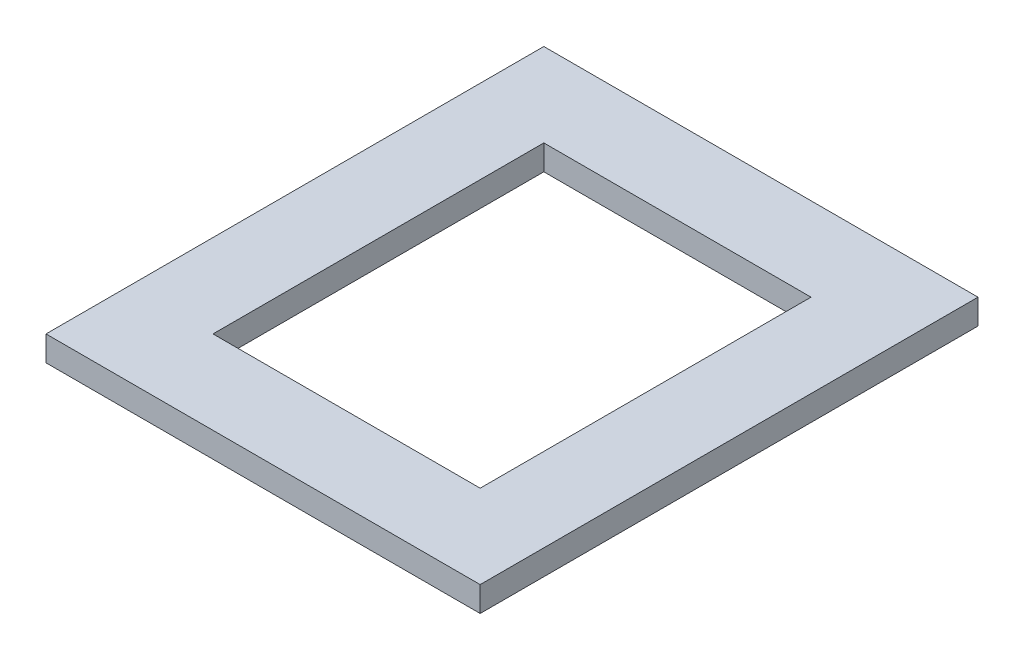
ISO-10303-21;
HEADER;
FILE_DESCRIPTION(('STEP AP214'),'2;1');
FILE_NAME('part.step','',(''),(''),'','','');
FILE_SCHEMA(('AUTOMOTIVE_DESIGN { 1 0 10303 214 1 1 1 1 }'));
ENDSEC;
DATA;
#1=APPLICATION_CONTEXT('core data for automotive mechanical design processes');
#2=APPLICATION_PROTOCOL_DEFINITION('international standard','automotive_design',2000,#1);
#3=PRODUCT_CONTEXT('',#1,'mechanical');
#4=PRODUCT('Part','Part','',(#3));
#5=PRODUCT_RELATED_PRODUCT_CATEGORY('part','',(#4));
#6=PRODUCT_DEFINITION_FORMATION('','',#4);
#7=PRODUCT_DEFINITION_CONTEXT('part definition',#1,'design');
#8=PRODUCT_DEFINITION('design','',#6,#7);
#9=PRODUCT_DEFINITION_SHAPE('','',#8);
#10=(LENGTH_UNIT() NAMED_UNIT(*) SI_UNIT(.MILLI.,.METRE.));
#11=(NAMED_UNIT(*) PLANE_ANGLE_UNIT() SI_UNIT($,.RADIAN.));
#12=(NAMED_UNIT(*) SI_UNIT($,.STERADIAN.) SOLID_ANGLE_UNIT());
#13=UNCERTAINTY_MEASURE_WITH_UNIT(LENGTH_MEASURE(1.E-05),#10,'distance_accuracy_value','');
#14=(GEOMETRIC_REPRESENTATION_CONTEXT(3) GLOBAL_UNCERTAINTY_ASSIGNED_CONTEXT((#13)) GLOBAL_UNIT_ASSIGNED_CONTEXT((#10,
#11,#12)) REPRESENTATION_CONTEXT('',''));
#15=CARTESIAN_POINT('',(0.,0.,0.));
#16=DIRECTION('',(0.,0.,1.));
#17=DIRECTION('',(1.,0.,0.));
#18=AXIS2_PLACEMENT_3D('',#15,#16,#17);
#19=CARTESIAN_POINT('',(0.,3.,0.));
#20=DIRECTION('',(0.,-1.,0.));
#21=DIRECTION('',(0.,0.,-1.));
#22=AXIS2_PLACEMENT_3D('',#19,#20,#21);
#23=PLANE('',#22);
#24=DIRECTION('',(0.,0.,-1.));
#25=VECTOR('',#24,1.);
#26=CARTESIAN_POINT('',(26.,3.,29.8129515889688));
#27=LINE('',#26,#25);
#28=CARTESIAN_POINT('',(26.,3.,29.8129515889688));
#29=VERTEX_POINT('',#28);
#30=CARTESIAN_POINT('',(26.,3.,-29.8129515889688));
#31=VERTEX_POINT('',#30);
#32=EDGE_CURVE('E157',#29,#31,#27,.T.);
#33=ORIENTED_EDGE('',*,*,#32,.T.);
#34=DIRECTION('',(-1.,0.,0.));
#35=VECTOR('',#34,1.);
#36=CARTESIAN_POINT('',(-26.,3.,-29.8129515889688));
#37=LINE('',#36,#35);
#38=CARTESIAN_POINT('',(-26.,3.,-29.8129515889688));
#39=VERTEX_POINT('',#38);
#40=EDGE_CURVE('E161',#31,#39,#37,.T.);
#41=ORIENTED_EDGE('',*,*,#40,.T.);
#42=DIRECTION('',(0.,0.,1.));
#43=VECTOR('',#42,1.);
#44=CARTESIAN_POINT('',(-26.,3.,29.8129515889688));
#45=LINE('',#44,#43);
#46=CARTESIAN_POINT('',(-26.,3.,29.8129515889688));
#47=VERTEX_POINT('',#46);
#48=EDGE_CURVE('E165',#39,#47,#45,.T.);
#49=ORIENTED_EDGE('',*,*,#48,.T.);
#50=DIRECTION('',(1.,0.,0.));
#51=VECTOR('',#50,1.);
#52=CARTESIAN_POINT('',(-26.,3.,29.8129515889688));
#53=LINE('',#52,#51);
#54=EDGE_CURVE('E168',#47,#29,#53,.T.);
#55=ORIENTED_EDGE('',*,*,#54,.T.);
#56=EDGE_LOOP('',(#33,#41,#49,#55));
#57=FACE_BOUND('',#56,.T.);
#58=DIRECTION('',(0.,0.,-1.));
#59=VECTOR('',#58,1.);
#60=CARTESIAN_POINT('',(16.,3.,19.8129515889688));
#61=LINE('',#60,#59);
#62=CARTESIAN_POINT('',(16.,3.,19.8129515889688));
#63=VERTEX_POINT('',#62);
#64=CARTESIAN_POINT('',(16.,3.,-19.8129515889688));
#65=VERTEX_POINT('',#64);
#66=EDGE_CURVE('E109',#63,#65,#61,.T.);
#67=ORIENTED_EDGE('',*,*,#66,.F.);
#68=DIRECTION('',(1.,0.,0.));
#69=VECTOR('',#68,1.);
#70=CARTESIAN_POINT('',(-16.,3.,19.8129515889688));
#71=LINE('',#70,#69);
#72=CARTESIAN_POINT('',(-16.,3.,19.8129515889688));
#73=VERTEX_POINT('',#72);
#74=EDGE_CURVE('E135',#73,#63,#71,.T.);
#75=ORIENTED_EDGE('',*,*,#74,.F.);
#76=DIRECTION('',(0.,0.,1.));
#77=VECTOR('',#76,1.);
#78=CARTESIAN_POINT('',(-16.,3.,19.8129515889688));
#79=LINE('',#78,#77);
#80=CARTESIAN_POINT('',(-16.,3.,-19.8129515889688));
#81=VERTEX_POINT('',#80);
#82=EDGE_CURVE('E131',#81,#73,#79,.T.);
#83=ORIENTED_EDGE('',*,*,#82,.F.);
#84=DIRECTION('',(-1.,0.,0.));
#85=VECTOR('',#84,1.);
#86=CARTESIAN_POINT('',(-16.,3.,-19.8129515889688));
#87=LINE('',#86,#85);
#88=EDGE_CURVE('E118',#65,#81,#87,.T.);
#89=ORIENTED_EDGE('',*,*,#88,.F.);
#90=EDGE_LOOP('',(#67,#75,#83,#89));
#91=FACE_BOUND('',#90,.T.);
#92=ADVANCED_FACE('F43',(#57,#91),#23,.F.);
#93=CARTESIAN_POINT('',(0.,0.,0.));
#94=DIRECTION('',(0.,-1.,0.));
#95=DIRECTION('',(0.,0.,-1.));
#96=AXIS2_PLACEMENT_3D('',#93,#94,#95);
#97=PLANE('',#96);
#98=DIRECTION('',(0.,0.,-1.));
#99=VECTOR('',#98,1.);
#100=CARTESIAN_POINT('',(26.,0.,29.8129515889688));
#101=LINE('',#100,#99);
#102=CARTESIAN_POINT('',(26.,0.,29.8129515889688));
#103=VERTEX_POINT('',#102);
#104=CARTESIAN_POINT('',(26.,0.,-29.8129515889688));
#105=VERTEX_POINT('',#104);
#106=EDGE_CURVE('E127',#103,#105,#101,.T.);
#107=ORIENTED_EDGE('',*,*,#106,.F.);
#108=DIRECTION('',(1.,0.,0.));
#109=VECTOR('',#108,1.);
#110=CARTESIAN_POINT('',(-26.,0.,29.8129515889688));
#111=LINE('',#110,#109);
#112=CARTESIAN_POINT('',(-26.,0.,29.8129515889688));
#113=VERTEX_POINT('',#112);
#114=EDGE_CURVE('E162',#113,#103,#111,.T.);
#115=ORIENTED_EDGE('',*,*,#114,.F.);
#116=DIRECTION('',(0.,0.,1.));
#117=VECTOR('',#116,1.);
#118=CARTESIAN_POINT('',(-26.,0.,29.8129515889688));
#119=LINE('',#118,#117);
#120=CARTESIAN_POINT('',(-26.,0.,-29.8129515889688));
#121=VERTEX_POINT('',#120);
#122=EDGE_CURVE('E178',#121,#113,#119,.T.);
#123=ORIENTED_EDGE('',*,*,#122,.F.);
#124=DIRECTION('',(-1.,0.,0.));
#125=VECTOR('',#124,1.);
#126=CARTESIAN_POINT('',(-26.,0.,-29.8129515889688));
#127=LINE('',#126,#125);
#128=EDGE_CURVE('E175',#105,#121,#127,.T.);
#129=ORIENTED_EDGE('',*,*,#128,.F.);
#130=EDGE_LOOP('',(#107,#115,#123,#129));
#131=FACE_BOUND('',#130,.T.);
#132=DIRECTION('',(1.,0.,0.));
#133=VECTOR('',#132,1.);
#134=CARTESIAN_POINT('',(-16.,0.,19.8129515889688));
#135=LINE('',#134,#133);
#136=CARTESIAN_POINT('',(-16.,0.,19.8129515889688));
#137=VERTEX_POINT('',#136);
#138=CARTESIAN_POINT('',(16.,0.,19.8129515889688));
#139=VERTEX_POINT('',#138);
#140=EDGE_CURVE('E119',#137,#139,#135,.T.);
#141=ORIENTED_EDGE('',*,*,#140,.T.);
#142=DIRECTION('',(0.,0.,-1.));
#143=VECTOR('',#142,1.);
#144=CARTESIAN_POINT('',(16.,0.,19.8129515889688));
#145=LINE('',#144,#143);
#146=CARTESIAN_POINT('',(16.,0.,-19.8129515889688));
#147=VERTEX_POINT('',#146);
#148=EDGE_CURVE('E67',#139,#147,#145,.T.);
#149=ORIENTED_EDGE('',*,*,#148,.T.);
#150=DIRECTION('',(-1.,0.,0.));
#151=VECTOR('',#150,1.);
#152=CARTESIAN_POINT('',(-16.,0.,-19.8129515889688));
#153=LINE('',#152,#151);
#154=CARTESIAN_POINT('',(-16.,0.,-19.8129515889688));
#155=VERTEX_POINT('',#154);
#156=EDGE_CURVE('E125',#147,#155,#153,.T.);
#157=ORIENTED_EDGE('',*,*,#156,.T.);
#158=DIRECTION('',(0.,0.,1.));
#159=VECTOR('',#158,1.);
#160=CARTESIAN_POINT('',(-16.,0.,19.8129515889688));
#161=LINE('',#160,#159);
#162=EDGE_CURVE('E144',#155,#137,#161,.T.);
#163=ORIENTED_EDGE('',*,*,#162,.T.);
#164=EDGE_LOOP('',(#141,#149,#157,#163));
#165=FACE_BOUND('',#164,.T.);
#166=ADVANCED_FACE('F201',(#131,#165),#97,.T.);
#167=CARTESIAN_POINT('',(26.,3.,29.8129515889688));
#168=DIRECTION('',(-1.,0.,0.));
#169=DIRECTION('',(0.,0.,1.));
#170=AXIS2_PLACEMENT_3D('',#167,#168,#169);
#171=PLANE('',#170);
#172=ORIENTED_EDGE('',*,*,#106,.T.);
#173=DIRECTION('',(0.,-1.,0.));
#174=VECTOR('',#173,1.);
#175=CARTESIAN_POINT('',(26.,3.,-29.8129515889688));
#176=LINE('',#175,#174);
#177=EDGE_CURVE('E11',#31,#105,#176,.T.);
#178=ORIENTED_EDGE('',*,*,#177,.F.);
#179=ORIENTED_EDGE('',*,*,#32,.F.);
#180=DIRECTION('',(0.,-1.,0.));
#181=VECTOR('',#180,1.);
#182=CARTESIAN_POINT('',(26.,3.,29.8129515889688));
#183=LINE('',#182,#181);
#184=EDGE_CURVE('E171',#29,#103,#183,.T.);
#185=ORIENTED_EDGE('',*,*,#184,.T.);
#186=EDGE_LOOP('',(#172,#178,#179,#185));
#187=FACE_BOUND('',#186,.T.);
#188=ADVANCED_FACE('F45',(#187),#171,.F.);
#189=CARTESIAN_POINT('',(-26.,3.,-29.8129515889688));
#190=DIRECTION('',(0.,0.,1.));
#191=DIRECTION('',(1.,0.,0.));
#192=AXIS2_PLACEMENT_3D('',#189,#190,#191);
#193=PLANE('',#192);
#194=ORIENTED_EDGE('',*,*,#128,.T.);
#195=DIRECTION('',(0.,-1.,0.));
#196=VECTOR('',#195,1.);
#197=CARTESIAN_POINT('',(-26.,3.,-29.8129515889688));
#198=LINE('',#197,#196);
#199=EDGE_CURVE('E52',#39,#121,#198,.T.);
#200=ORIENTED_EDGE('',*,*,#199,.F.);
#201=ORIENTED_EDGE('',*,*,#40,.F.);
#202=ORIENTED_EDGE('',*,*,#177,.T.);
#203=EDGE_LOOP('',(#194,#200,#201,#202));
#204=FACE_BOUND('',#203,.T.);
#205=ADVANCED_FACE('F211',(#204),#193,.F.);
#206=CARTESIAN_POINT('',(-26.,3.,29.8129515889688));
#207=DIRECTION('',(1.,0.,0.));
#208=DIRECTION('',(0.,0.,-1.));
#209=AXIS2_PLACEMENT_3D('',#206,#207,#208);
#210=PLANE('',#209);
#211=ORIENTED_EDGE('',*,*,#122,.T.);
#212=DIRECTION('',(0.,-1.,0.));
#213=VECTOR('',#212,1.);
#214=CARTESIAN_POINT('',(-26.,3.,29.8129515889688));
#215=LINE('',#214,#213);
#216=EDGE_CURVE('E186',#47,#113,#215,.T.);
#217=ORIENTED_EDGE('',*,*,#216,.F.);
#218=ORIENTED_EDGE('',*,*,#48,.F.);
#219=ORIENTED_EDGE('',*,*,#199,.T.);
#220=EDGE_LOOP('',(#211,#217,#218,#219));
#221=FACE_BOUND('',#220,.T.);
#222=ADVANCED_FACE('F195',(#221),#210,.F.);
#223=CARTESIAN_POINT('',(-26.,3.,29.8129515889688));
#224=DIRECTION('',(0.,0.,-1.));
#225=DIRECTION('',(-1.,0.,0.));
#226=AXIS2_PLACEMENT_3D('',#223,#224,#225);
#227=PLANE('',#226);
#228=ORIENTED_EDGE('',*,*,#114,.T.);
#229=ORIENTED_EDGE('',*,*,#184,.F.);
#230=ORIENTED_EDGE('',*,*,#54,.F.);
#231=ORIENTED_EDGE('',*,*,#216,.T.);
#232=EDGE_LOOP('',(#228,#229,#230,#231));
#233=FACE_BOUND('',#232,.T.);
#234=ADVANCED_FACE('F205',(#233),#227,.F.);
#235=CARTESIAN_POINT('',(16.,3.,19.8129515889688));
#236=DIRECTION('',(-1.,0.,0.));
#237=DIRECTION('',(0.,0.,1.));
#238=AXIS2_PLACEMENT_3D('',#235,#236,#237);
#239=PLANE('',#238);
#240=ORIENTED_EDGE('',*,*,#148,.F.);
#241=DIRECTION('',(0.,-1.,0.));
#242=VECTOR('',#241,1.);
#243=CARTESIAN_POINT('',(16.,3.,19.8129515889688));
#244=LINE('',#243,#242);
#245=EDGE_CURVE('E113',#63,#139,#244,.T.);
#246=ORIENTED_EDGE('',*,*,#245,.F.);
#247=ORIENTED_EDGE('',*,*,#66,.T.);
#248=DIRECTION('',(0.,-1.,0.));
#249=VECTOR('',#248,1.);
#250=CARTESIAN_POINT('',(16.,3.,-19.8129515889688));
#251=LINE('',#250,#249);
#252=EDGE_CURVE('E112',#65,#147,#251,.T.);
#253=ORIENTED_EDGE('',*,*,#252,.T.);
#254=EDGE_LOOP('',(#240,#246,#247,#253));
#255=FACE_BOUND('',#254,.T.);
#256=ADVANCED_FACE('F111',(#255),#239,.T.);
#257=CARTESIAN_POINT('',(-16.,3.,-19.8129515889688));
#258=DIRECTION('',(0.,0.,1.));
#259=DIRECTION('',(1.,0.,0.));
#260=AXIS2_PLACEMENT_3D('',#257,#258,#259);
#261=PLANE('',#260);
#262=ORIENTED_EDGE('',*,*,#156,.F.);
#263=ORIENTED_EDGE('',*,*,#252,.F.);
#264=ORIENTED_EDGE('',*,*,#88,.T.);
#265=DIRECTION('',(0.,-1.,0.));
#266=VECTOR('',#265,1.);
#267=CARTESIAN_POINT('',(-16.,3.,-19.8129515889688));
#268=LINE('',#267,#266);
#269=EDGE_CURVE('E128',#81,#155,#268,.T.);
#270=ORIENTED_EDGE('',*,*,#269,.T.);
#271=EDGE_LOOP('',(#262,#263,#264,#270));
#272=FACE_BOUND('',#271,.T.);
#273=ADVANCED_FACE('F122',(#272),#261,.T.);
#274=CARTESIAN_POINT('',(-16.,3.,19.8129515889688));
#275=DIRECTION('',(1.,0.,0.));
#276=DIRECTION('',(0.,0.,-1.));
#277=AXIS2_PLACEMENT_3D('',#274,#275,#276);
#278=PLANE('',#277);
#279=ORIENTED_EDGE('',*,*,#162,.F.);
#280=ORIENTED_EDGE('',*,*,#269,.F.);
#281=ORIENTED_EDGE('',*,*,#82,.T.);
#282=DIRECTION('',(0.,-1.,0.));
#283=VECTOR('',#282,1.);
#284=CARTESIAN_POINT('',(-16.,3.,19.8129515889688));
#285=LINE('',#284,#283);
#286=EDGE_CURVE('E59',#73,#137,#285,.T.);
#287=ORIENTED_EDGE('',*,*,#286,.T.);
#288=EDGE_LOOP('',(#279,#280,#281,#287));
#289=FACE_BOUND('',#288,.T.);
#290=ADVANCED_FACE('F234',(#289),#278,.T.);
#291=CARTESIAN_POINT('',(-16.,3.,19.8129515889688));
#292=DIRECTION('',(0.,0.,-1.));
#293=DIRECTION('',(-1.,0.,0.));
#294=AXIS2_PLACEMENT_3D('',#291,#292,#293);
#295=PLANE('',#294);
#296=ORIENTED_EDGE('',*,*,#140,.F.);
#297=ORIENTED_EDGE('',*,*,#286,.F.);
#298=ORIENTED_EDGE('',*,*,#74,.T.);
#299=ORIENTED_EDGE('',*,*,#245,.T.);
#300=EDGE_LOOP('',(#296,#297,#298,#299));
#301=FACE_BOUND('',#300,.T.);
#302=ADVANCED_FACE('F238',(#301),#295,.T.);
#303=CLOSED_SHELL('',(#92,#166,#188,#205,#222,#234,#256,#273,#290,#302));
#304=MANIFOLD_SOLID_BREP('B2',#303);
#305=ADVANCED_BREP_SHAPE_REPRESENTATION('',(#18,#304),#14);
#306=SHAPE_DEFINITION_REPRESENTATION(#9,#305);
ENDSEC;
END-ISO-10303-21;
